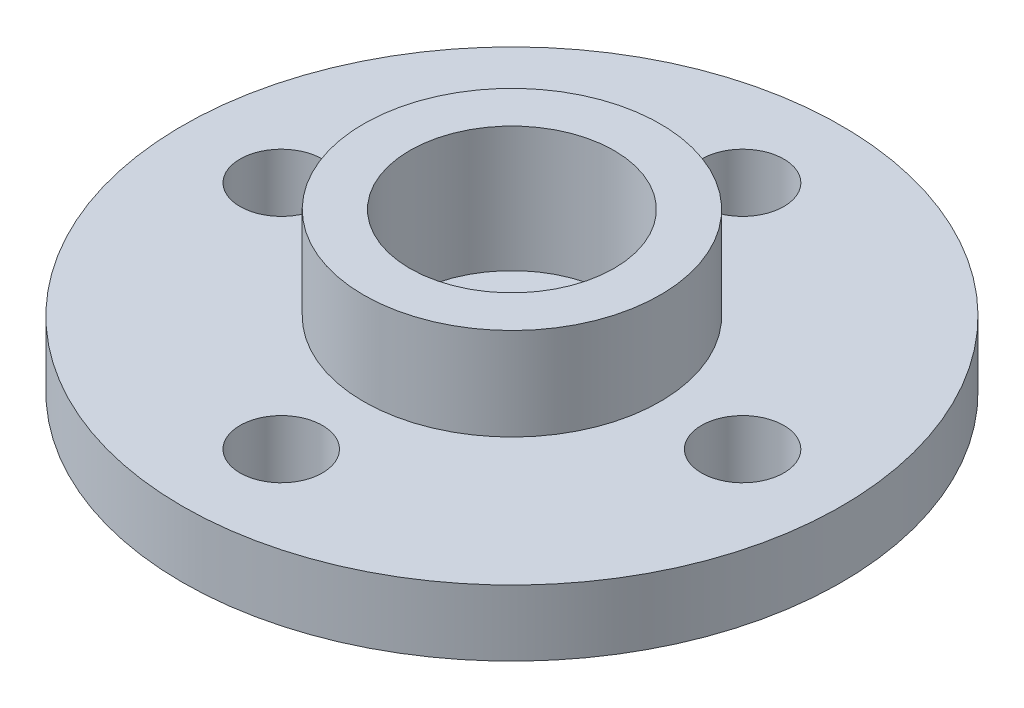
ISO-10303-21;
HEADER;
FILE_DESCRIPTION(('STEP AP214'),'2;1');
FILE_NAME('part.step','',(''),(''),'','','');
FILE_SCHEMA(('AUTOMOTIVE_DESIGN { 1 0 10303 214 1 1 1 1 }'));
ENDSEC;
DATA;
#1=APPLICATION_CONTEXT('core data for automotive mechanical design processes');
#2=APPLICATION_PROTOCOL_DEFINITION('international standard','automotive_design',2000,#1);
#3=PRODUCT_CONTEXT('',#1,'mechanical');
#4=PRODUCT('Part','Part','',(#3));
#5=PRODUCT_RELATED_PRODUCT_CATEGORY('part','',(#4));
#6=PRODUCT_DEFINITION_FORMATION('','',#4);
#7=PRODUCT_DEFINITION_CONTEXT('part definition',#1,'design');
#8=PRODUCT_DEFINITION('design','',#6,#7);
#9=PRODUCT_DEFINITION_SHAPE('','',#8);
#10=(LENGTH_UNIT() NAMED_UNIT(*) SI_UNIT(.MILLI.,.METRE.));
#11=(NAMED_UNIT(*) PLANE_ANGLE_UNIT() SI_UNIT($,.RADIAN.));
#12=(NAMED_UNIT(*) SI_UNIT($,.STERADIAN.) SOLID_ANGLE_UNIT());
#13=UNCERTAINTY_MEASURE_WITH_UNIT(LENGTH_MEASURE(1.E-05),#10,'distance_accuracy_value','');
#14=(GEOMETRIC_REPRESENTATION_CONTEXT(3) GLOBAL_UNCERTAINTY_ASSIGNED_CONTEXT((#13)) GLOBAL_UNIT_ASSIGNED_CONTEXT((#10,
#11,#12)) REPRESENTATION_CONTEXT('',''));
#15=CARTESIAN_POINT('',(0.,0.,0.));
#16=DIRECTION('',(0.,0.,1.));
#17=DIRECTION('',(1.,0.,0.));
#18=AXIS2_PLACEMENT_3D('',#15,#16,#17);
#19=CARTESIAN_POINT('',(0.,2.,0.));
#20=DIRECTION('',(0.,-1.,0.));
#21=DIRECTION('',(0.,0.,-1.));
#22=AXIS2_PLACEMENT_3D('',#19,#20,#21);
#23=CYLINDRICAL_SURFACE('',#22,10.);
#24=CARTESIAN_POINT('',(0.,2.,0.));
#25=DIRECTION('',(0.,1.,0.));
#26=DIRECTION('',(0.,0.,1.));
#27=AXIS2_PLACEMENT_3D('',#24,#25,#26);
#28=CIRCLE('',#27,10.);
#29=CARTESIAN_POINT('',(0.,2.,10.));
#30=VERTEX_POINT('',#29);
#31=EDGE_CURVE('E10',#30,#30,#28,.T.);
#32=ORIENTED_EDGE('',*,*,#31,.F.);
#33=EDGE_LOOP('',(#32));
#34=FACE_BOUND('',#33,.T.);
#35=CARTESIAN_POINT('',(0.,0.,0.));
#36=DIRECTION('',(0.,1.,0.));
#37=DIRECTION('',(0.,0.,1.));
#38=AXIS2_PLACEMENT_3D('',#35,#36,#37);
#39=CIRCLE('',#38,10.);
#40=CARTESIAN_POINT('',(0.,0.,10.));
#41=VERTEX_POINT('',#40);
#42=EDGE_CURVE('E40',#41,#41,#39,.T.);
#43=ORIENTED_EDGE('',*,*,#42,.T.);
#44=EDGE_LOOP('',(#43));
#45=FACE_BOUND('',#44,.T.);
#46=ADVANCED_FACE('F33',(#34,#45),#23,.T.);
#47=CARTESIAN_POINT('',(0.,2.,0.));
#48=DIRECTION('',(0.,1.,0.));
#49=DIRECTION('',(0.,0.,1.));
#50=AXIS2_PLACEMENT_3D('',#47,#48,#49);
#51=PLANE('',#50);
#52=CARTESIAN_POINT('',(0.,2.,-7.));
#53=DIRECTION('',(0.,1.,0.));
#54=DIRECTION('',(0.,0.,1.));
#55=AXIS2_PLACEMENT_3D('',#52,#53,#54);
#56=CIRCLE('',#55,1.25);
#57=CARTESIAN_POINT('',(0.,2.,-5.75));
#58=VERTEX_POINT('',#57);
#59=EDGE_CURVE('E78',#58,#58,#56,.T.);
#60=ORIENTED_EDGE('',*,*,#59,.F.);
#61=EDGE_LOOP('',(#60));
#62=FACE_BOUND('',#61,.T.);
#63=CARTESIAN_POINT('',(7.,2.,0.));
#64=DIRECTION('',(0.,1.,0.));
#65=DIRECTION('',(0.,0.,1.));
#66=AXIS2_PLACEMENT_3D('',#63,#64,#65);
#67=CIRCLE('',#66,1.25);
#68=CARTESIAN_POINT('',(7.,2.,1.25000000000005));
#69=VERTEX_POINT('',#68);
#70=EDGE_CURVE('E71',#69,#69,#67,.T.);
#71=ORIENTED_EDGE('',*,*,#70,.F.);
#72=EDGE_LOOP('',(#71));
#73=FACE_BOUND('',#72,.T.);
#74=CARTESIAN_POINT('',(0.,2.,7.));
#75=DIRECTION('',(0.,1.,0.));
#76=DIRECTION('',(0.,0.,1.));
#77=AXIS2_PLACEMENT_3D('',#74,#75,#76);
#78=CIRCLE('',#77,1.25);
#79=CARTESIAN_POINT('',(0.,2.,8.25));
#80=VERTEX_POINT('',#79);
#81=EDGE_CURVE('E72',#80,#80,#78,.T.);
#82=ORIENTED_EDGE('',*,*,#81,.F.);
#83=EDGE_LOOP('',(#82));
#84=FACE_BOUND('',#83,.T.);
#85=CARTESIAN_POINT('',(-7.,2.,0.));
#86=DIRECTION('',(0.,1.,0.));
#87=DIRECTION('',(0.,0.,1.));
#88=AXIS2_PLACEMENT_3D('',#85,#86,#87);
#89=CIRCLE('',#88,1.25);
#90=CARTESIAN_POINT('',(-7.,2.,1.25));
#91=VERTEX_POINT('',#90);
#92=EDGE_CURVE('E64',#91,#91,#89,.T.);
#93=ORIENTED_EDGE('',*,*,#92,.F.);
#94=EDGE_LOOP('',(#93));
#95=FACE_BOUND('',#94,.T.);
#96=CARTESIAN_POINT('',(0.,2.,0.));
#97=DIRECTION('',(0.,1.,0.));
#98=DIRECTION('',(0.,0.,1.));
#99=AXIS2_PLACEMENT_3D('',#96,#97,#98);
#100=CIRCLE('',#99,4.5);
#101=CARTESIAN_POINT('',(0.,2.,4.5));
#102=VERTEX_POINT('',#101);
#103=EDGE_CURVE('E47',#102,#102,#100,.T.);
#104=ORIENTED_EDGE('',*,*,#103,.F.);
#105=EDGE_LOOP('',(#104));
#106=FACE_BOUND('',#105,.T.);
#107=ORIENTED_EDGE('',*,*,#31,.T.);
#108=EDGE_LOOP('',(#107));
#109=FACE_BOUND('',#108,.T.);
#110=ADVANCED_FACE('F89',(#62,#73,#84,#95,#106,#109),#51,.T.);
#111=CARTESIAN_POINT('',(0.,0.,0.));
#112=DIRECTION('',(0.,1.,0.));
#113=DIRECTION('',(0.,0.,1.));
#114=AXIS2_PLACEMENT_3D('',#111,#112,#113);
#115=PLANE('',#114);
#116=CARTESIAN_POINT('',(0.,0.,-7.));
#117=DIRECTION('',(0.,1.,0.));
#118=DIRECTION('',(0.,0.,1.));
#119=AXIS2_PLACEMENT_3D('',#116,#117,#118);
#120=CIRCLE('',#119,1.25);
#121=CARTESIAN_POINT('',(0.,0.,-5.75));
#122=VERTEX_POINT('',#121);
#123=EDGE_CURVE('E67',#122,#122,#120,.F.);
#124=ORIENTED_EDGE('',*,*,#123,.F.);
#125=EDGE_LOOP('',(#124));
#126=FACE_BOUND('',#125,.T.);
#127=CARTESIAN_POINT('',(7.,0.,0.));
#128=DIRECTION('',(0.,1.,0.));
#129=DIRECTION('',(0.,0.,1.));
#130=AXIS2_PLACEMENT_3D('',#127,#128,#129);
#131=CIRCLE('',#130,1.25);
#132=CARTESIAN_POINT('',(7.,0.,1.25000000000005));
#133=VERTEX_POINT('',#132);
#134=EDGE_CURVE('E75',#133,#133,#131,.F.);
#135=ORIENTED_EDGE('',*,*,#134,.F.);
#136=EDGE_LOOP('',(#135));
#137=FACE_BOUND('',#136,.T.);
#138=CARTESIAN_POINT('',(0.,0.,7.));
#139=DIRECTION('',(0.,1.,0.));
#140=DIRECTION('',(0.,0.,1.));
#141=AXIS2_PLACEMENT_3D('',#138,#139,#140);
#142=CIRCLE('',#141,1.25);
#143=CARTESIAN_POINT('',(0.,0.,8.25));
#144=VERTEX_POINT('',#143);
#145=EDGE_CURVE('E68',#144,#144,#142,.F.);
#146=ORIENTED_EDGE('',*,*,#145,.F.);
#147=EDGE_LOOP('',(#146));
#148=FACE_BOUND('',#147,.T.);
#149=CARTESIAN_POINT('',(-7.,0.,0.));
#150=DIRECTION('',(0.,1.,0.));
#151=DIRECTION('',(0.,0.,1.));
#152=AXIS2_PLACEMENT_3D('',#149,#150,#151);
#153=CIRCLE('',#152,1.25);
#154=CARTESIAN_POINT('',(-7.,0.,1.25));
#155=VERTEX_POINT('',#154);
#156=EDGE_CURVE('E61',#155,#155,#153,.F.);
#157=ORIENTED_EDGE('',*,*,#156,.F.);
#158=EDGE_LOOP('',(#157));
#159=FACE_BOUND('',#158,.T.);
#160=CARTESIAN_POINT('',(0.,0.,0.));
#161=DIRECTION('',(0.,1.,0.));
#162=DIRECTION('',(0.,0.,1.));
#163=AXIS2_PLACEMENT_3D('',#160,#161,#162);
#164=CIRCLE('',#163,1.6);
#165=CARTESIAN_POINT('',(0.,0.,-1.6));
#166=VERTEX_POINT('',#165);
#167=EDGE_CURVE('E58',#166,#166,#164,.F.);
#168=ORIENTED_EDGE('',*,*,#167,.F.);
#169=EDGE_LOOP('',(#168));
#170=FACE_BOUND('',#169,.T.);
#171=ORIENTED_EDGE('',*,*,#42,.F.);
#172=EDGE_LOOP('',(#171));
#173=FACE_BOUND('',#172,.T.);
#174=ADVANCED_FACE('F92',(#126,#137,#148,#159,#170,#173),#115,.F.);
#175=CARTESIAN_POINT('',(0.,4.8,0.));
#176=DIRECTION('',(0.,-1.,0.));
#177=DIRECTION('',(0.,0.,-1.));
#178=AXIS2_PLACEMENT_3D('',#175,#176,#177);
#179=CYLINDRICAL_SURFACE('',#178,4.5);
#180=CARTESIAN_POINT('',(0.,4.8,0.));
#181=DIRECTION('',(0.,1.,0.));
#182=DIRECTION('',(0.,0.,1.));
#183=AXIS2_PLACEMENT_3D('',#180,#181,#182);
#184=CIRCLE('',#183,4.5);
#185=CARTESIAN_POINT('',(0.,4.8,4.5));
#186=VERTEX_POINT('',#185);
#187=EDGE_CURVE('E45',#186,#186,#184,.T.);
#188=ORIENTED_EDGE('',*,*,#187,.F.);
#189=EDGE_LOOP('',(#188));
#190=FACE_BOUND('',#189,.T.);
#191=ORIENTED_EDGE('',*,*,#103,.T.);
#192=EDGE_LOOP('',(#191));
#193=FACE_BOUND('',#192,.T.);
#194=ADVANCED_FACE('F102',(#190,#193),#179,.T.);
#195=CARTESIAN_POINT('',(0.,4.8,0.));
#196=DIRECTION('',(0.,1.,0.));
#197=DIRECTION('',(0.,0.,1.));
#198=AXIS2_PLACEMENT_3D('',#195,#196,#197);
#199=PLANE('',#198);
#200=CARTESIAN_POINT('',(0.,4.8,0.));
#201=DIRECTION('',(0.,1.,0.));
#202=DIRECTION('',(0.,0.,1.));
#203=AXIS2_PLACEMENT_3D('',#200,#201,#202);
#204=CIRCLE('',#203,3.1);
#205=CARTESIAN_POINT('',(0.,4.8,3.1));
#206=VERTEX_POINT('',#205);
#207=EDGE_CURVE('E53',#206,#206,#204,.T.);
#208=ORIENTED_EDGE('',*,*,#207,.F.);
#209=EDGE_LOOP('',(#208));
#210=FACE_BOUND('',#209,.T.);
#211=ORIENTED_EDGE('',*,*,#187,.T.);
#212=EDGE_LOOP('',(#211));
#213=FACE_BOUND('',#212,.T.);
#214=ADVANCED_FACE('F104',(#210,#213),#199,.T.);
#215=CARTESIAN_POINT('',(0.,1.,0.));
#216=DIRECTION('',(0.,1.,0.));
#217=DIRECTION('',(0.,0.,1.));
#218=AXIS2_PLACEMENT_3D('',#215,#216,#217);
#219=CYLINDRICAL_SURFACE('',#218,3.1);
#220=CARTESIAN_POINT('',(0.,1.,0.));
#221=DIRECTION('',(0.,1.,0.));
#222=DIRECTION('',(0.,0.,1.));
#223=AXIS2_PLACEMENT_3D('',#220,#221,#222);
#224=CIRCLE('',#223,3.1);
#225=CARTESIAN_POINT('',(0.,1.,3.1));
#226=VERTEX_POINT('',#225);
#227=EDGE_CURVE('E50',#226,#226,#224,.T.);
#228=CARTESIAN_POINT('',(0.,1.,3.1));
#229=CARTESIAN_POINT('',(0.,1.03958333333333,3.1));
#230=CARTESIAN_POINT('',(0.,1.07916666666667,3.1));
#231=CARTESIAN_POINT('',(0.,1.15833333333333,3.1));
#232=CARTESIAN_POINT('',(0.,1.19791666666667,3.1));
#233=CARTESIAN_POINT('',(0.,1.27708333333333,3.1));
#234=CARTESIAN_POINT('',(0.,1.31666666666667,3.1));
#235=CARTESIAN_POINT('',(0.,1.39583333333333,3.1));
#236=CARTESIAN_POINT('',(0.,1.43541666666667,3.1));
#237=CARTESIAN_POINT('',(0.,1.51458333333333,3.1));
#238=CARTESIAN_POINT('',(0.,1.55416666666667,3.1));
#239=CARTESIAN_POINT('',(0.,1.63333333333333,3.1));
#240=CARTESIAN_POINT('',(0.,1.67291666666667,3.1));
#241=CARTESIAN_POINT('',(0.,1.75208333333333,3.1));
#242=CARTESIAN_POINT('',(0.,1.79166666666667,3.1));
#243=CARTESIAN_POINT('',(0.,1.87083333333333,3.1));
#244=CARTESIAN_POINT('',(0.,1.91041666666667,3.1));
#245=CARTESIAN_POINT('',(0.,1.98958333333333,3.1));
#246=CARTESIAN_POINT('',(0.,2.02916666666667,3.1));
#247=CARTESIAN_POINT('',(0.,2.10833333333333,3.1));
#248=CARTESIAN_POINT('',(0.,2.14791666666667,3.1));
#249=CARTESIAN_POINT('',(0.,2.22708333333333,3.1));
#250=CARTESIAN_POINT('',(0.,2.26666666666667,3.1));
#251=CARTESIAN_POINT('',(0.,2.34583333333333,3.1));
#252=CARTESIAN_POINT('',(0.,2.38541666666667,3.1));
#253=CARTESIAN_POINT('',(0.,2.46458333333333,3.1));
#254=CARTESIAN_POINT('',(0.,2.50416666666667,3.1));
#255=CARTESIAN_POINT('',(0.,2.58333333333333,3.1));
#256=CARTESIAN_POINT('',(0.,2.62291666666667,3.1));
#257=CARTESIAN_POINT('',(0.,2.70208333333333,3.1));
#258=CARTESIAN_POINT('',(0.,2.74166666666667,3.1));
#259=CARTESIAN_POINT('',(0.,2.82083333333333,3.1));
#260=CARTESIAN_POINT('',(0.,2.86041666666667,3.1));
#261=CARTESIAN_POINT('',(0.,2.93958333333333,3.1));
#262=CARTESIAN_POINT('',(0.,2.97916666666667,3.1));
#263=CARTESIAN_POINT('',(0.,3.05833333333333,3.1));
#264=CARTESIAN_POINT('',(0.,3.09791666666667,3.1));
#265=CARTESIAN_POINT('',(0.,3.17708333333333,3.1));
#266=CARTESIAN_POINT('',(0.,3.21666666666667,3.1));
#267=CARTESIAN_POINT('',(0.,3.29583333333333,3.1));
#268=CARTESIAN_POINT('',(0.,3.33541666666667,3.1));
#269=CARTESIAN_POINT('',(0.,3.41458333333333,3.1));
#270=CARTESIAN_POINT('',(0.,3.45416666666667,3.1));
#271=CARTESIAN_POINT('',(0.,3.53333333333333,3.1));
#272=CARTESIAN_POINT('',(0.,3.57291666666667,3.1));
#273=CARTESIAN_POINT('',(0.,3.65208333333333,3.1));
#274=CARTESIAN_POINT('',(0.,3.69166666666667,3.1));
#275=CARTESIAN_POINT('',(0.,3.77083333333333,3.1));
#276=CARTESIAN_POINT('',(0.,3.81041666666667,3.1));
#277=CARTESIAN_POINT('',(0.,3.88958333333333,3.1));
#278=CARTESIAN_POINT('',(0.,3.92916666666667,3.1));
#279=CARTESIAN_POINT('',(0.,4.00833333333333,3.1));
#280=CARTESIAN_POINT('',(0.,4.04791666666667,3.1));
#281=CARTESIAN_POINT('',(0.,4.12708333333333,3.1));
#282=CARTESIAN_POINT('',(0.,4.16666666666667,3.1));
#283=CARTESIAN_POINT('',(0.,4.24583333333333,3.1));
#284=CARTESIAN_POINT('',(0.,4.28541666666667,3.1));
#285=CARTESIAN_POINT('',(0.,4.36458333333333,3.1));
#286=CARTESIAN_POINT('',(0.,4.40416666666667,3.1));
#287=CARTESIAN_POINT('',(0.,4.48333333333333,3.1));
#288=CARTESIAN_POINT('',(0.,4.52291666666667,3.1));
#289=CARTESIAN_POINT('',(0.,4.60208333333333,3.1));
#290=CARTESIAN_POINT('',(0.,4.64166666666667,3.1));
#291=CARTESIAN_POINT('',(0.,4.72083333333333,3.1));
#292=CARTESIAN_POINT('',(0.,4.76041666666667,3.1));
#293=CARTESIAN_POINT('',(0.,4.8,3.1));
#294=B_SPLINE_CURVE_WITH_KNOTS('',3,(#228,#229,#230,#231,#232,#233,#234,#235,#236,#237,#238,
#239,#240,#241,#242,#243,#244,#245,#246,#247,#248,#249,#250,#251,#252,#253,#254,#255,#256,#257,
#258,#259,#260,#261,#262,#263,#264,#265,#266,#267,#268,#269,#270,#271,#272,#273,#274,#275,#276,
#277,#278,#279,#280,#281,#282,#283,#284,#285,#286,#287,#288,#289,#290,#291,#292,#293),
.UNSPECIFIED.,.F.,.F.,(4,2,2,2,2,2,2,2,2,2,2,2,2,2,2,2,2,2,2,2,2,2,2,2,2,2,2,2,2,2,2,2,4),(0.,
0.11875,0.2375,0.35625,0.475,0.59375,0.7125,0.83125,0.95,1.06875,1.1875,1.30625,1.425,1.54375,
1.6625,1.78125,1.9,2.01875,2.1375,2.25625,2.375,2.49375,2.6125,2.73125,2.85,2.96875,3.0875,
3.20625,3.325,3.44375,3.5625,3.68125,3.8),.UNSPECIFIED.);
#295=EDGE_CURVE('BSEAM111',#226,#206,#294,.T.);
#296=ORIENTED_EDGE('',*,*,#227,.F.);
#297=ORIENTED_EDGE('',*,*,#207,.T.);
#298=ORIENTED_EDGE('',*,*,#295,.T.);
#299=ORIENTED_EDGE('',*,*,#295,.F.);
#300=EDGE_LOOP('',(#296,#298,#297,#299));
#301=FACE_BOUND('',#300,.T.);
#302=ADVANCED_FACE('F111',(#301),#219,.F.);
#303=CARTESIAN_POINT('',(0.,1.,0.));
#304=DIRECTION('',(0.,1.,0.));
#305=DIRECTION('',(0.,0.,1.));
#306=AXIS2_PLACEMENT_3D('',#303,#304,#305);
#307=PLANE('',#306);
#308=CARTESIAN_POINT('',(0.,1.,0.));
#309=DIRECTION('',(0.,1.,0.));
#310=DIRECTION('',(0.,0.,1.));
#311=AXIS2_PLACEMENT_3D('',#308,#309,#310);
#312=CIRCLE('',#311,1.6);
#313=CARTESIAN_POINT('',(0.,1.,-1.6));
#314=VERTEX_POINT('',#313);
#315=EDGE_CURVE('E36',#314,#314,#312,.F.);
#316=ORIENTED_EDGE('',*,*,#315,.T.);
#317=EDGE_LOOP('',(#316));
#318=FACE_BOUND('',#317,.T.);
#319=ORIENTED_EDGE('',*,*,#227,.T.);
#320=EDGE_LOOP('',(#319));
#321=FACE_BOUND('',#320,.T.);
#322=ADVANCED_FACE('F180',(#318,#321),#307,.T.);
#323=CARTESIAN_POINT('',(0.,4.8,0.));
#324=DIRECTION('',(0.,-1.,0.));
#325=DIRECTION('',(0.,0.,-1.));
#326=AXIS2_PLACEMENT_3D('',#323,#324,#325);
#327=CYLINDRICAL_SURFACE('',#326,1.6);
#328=CARTESIAN_POINT('',(0.,1.,-1.6));
#329=CARTESIAN_POINT('',(0.,0.989583333333334,-1.6));
#330=CARTESIAN_POINT('',(0.,0.979166666666667,-1.6));
#331=CARTESIAN_POINT('',(0.,0.958333333333334,-1.6));
#332=CARTESIAN_POINT('',(0.,0.947916666666667,-1.6));
#333=CARTESIAN_POINT('',(0.,0.927083333333334,-1.6));
#334=CARTESIAN_POINT('',(0.,0.916666666666667,-1.6));
#335=CARTESIAN_POINT('',(0.,0.895833333333334,-1.6));
#336=CARTESIAN_POINT('',(0.,0.885416666666667,-1.6));
#337=CARTESIAN_POINT('',(0.,0.864583333333334,-1.6));
#338=CARTESIAN_POINT('',(0.,0.854166666666667,-1.6));
#339=CARTESIAN_POINT('',(0.,0.833333333333334,-1.6));
#340=CARTESIAN_POINT('',(0.,0.822916666666667,-1.6));
#341=CARTESIAN_POINT('',(0.,0.802083333333334,-1.6));
#342=CARTESIAN_POINT('',(0.,0.791666666666667,-1.6));
#343=CARTESIAN_POINT('',(0.,0.770833333333334,-1.6));
#344=CARTESIAN_POINT('',(0.,0.760416666666667,-1.6));
#345=CARTESIAN_POINT('',(0.,0.739583333333334,-1.6));
#346=CARTESIAN_POINT('',(0.,0.729166666666667,-1.6));
#347=CARTESIAN_POINT('',(0.,0.708333333333334,-1.6));
#348=CARTESIAN_POINT('',(0.,0.697916666666667,-1.6));
#349=CARTESIAN_POINT('',(0.,0.677083333333334,-1.6));
#350=CARTESIAN_POINT('',(0.,0.666666666666667,-1.6));
#351=CARTESIAN_POINT('',(0.,0.645833333333334,-1.6));
#352=CARTESIAN_POINT('',(0.,0.635416666666667,-1.6));
#353=CARTESIAN_POINT('',(0.,0.614583333333334,-1.6));
#354=CARTESIAN_POINT('',(0.,0.604166666666667,-1.6));
#355=CARTESIAN_POINT('',(0.,0.583333333333334,-1.6));
#356=CARTESIAN_POINT('',(0.,0.572916666666667,-1.6));
#357=CARTESIAN_POINT('',(0.,0.552083333333334,-1.6));
#358=CARTESIAN_POINT('',(0.,0.541666666666667,-1.6));
#359=CARTESIAN_POINT('',(0.,0.520833333333333,-1.6));
#360=CARTESIAN_POINT('',(0.,0.510416666666666,-1.6));
#361=CARTESIAN_POINT('',(0.,0.489583333333333,-1.6));
#362=CARTESIAN_POINT('',(0.,0.479166666666666,-1.6));
#363=CARTESIAN_POINT('',(0.,0.458333333333333,-1.6));
#364=CARTESIAN_POINT('',(0.,0.447916666666666,-1.6));
#365=CARTESIAN_POINT('',(0.,0.427083333333333,-1.6));
#366=CARTESIAN_POINT('',(0.,0.416666666666666,-1.6));
#367=CARTESIAN_POINT('',(0.,0.395833333333333,-1.6));
#368=CARTESIAN_POINT('',(0.,0.385416666666666,-1.6));
#369=CARTESIAN_POINT('',(0.,0.364583333333333,-1.6));
#370=CARTESIAN_POINT('',(0.,0.354166666666666,-1.6));
#371=CARTESIAN_POINT('',(0.,0.333333333333333,-1.6));
#372=CARTESIAN_POINT('',(0.,0.322916666666666,-1.6));
#373=CARTESIAN_POINT('',(0.,0.302083333333333,-1.6));
#374=CARTESIAN_POINT('',(0.,0.291666666666666,-1.6));
#375=CARTESIAN_POINT('',(0.,0.270833333333333,-1.6));
#376=CARTESIAN_POINT('',(0.,0.260416666666666,-1.6));
#377=CARTESIAN_POINT('',(0.,0.239583333333333,-1.6));
#378=CARTESIAN_POINT('',(0.,0.229166666666666,-1.6));
#379=CARTESIAN_POINT('',(0.,0.208333333333333,-1.6));
#380=CARTESIAN_POINT('',(0.,0.197916666666666,-1.6));
#381=CARTESIAN_POINT('',(0.,0.177083333333333,-1.6));
#382=CARTESIAN_POINT('',(0.,0.166666666666666,-1.6));
#383=CARTESIAN_POINT('',(0.,0.145833333333333,-1.6));
#384=CARTESIAN_POINT('',(0.,0.135416666666666,-1.6));
#385=CARTESIAN_POINT('',(0.,0.114583333333333,-1.6));
#386=CARTESIAN_POINT('',(0.,0.104166666666666,-1.6));
#387=CARTESIAN_POINT('',(0.,0.0833333333333325,-1.6));
#388=CARTESIAN_POINT('',(0.,0.0729166666666659,-1.6));
#389=CARTESIAN_POINT('',(0.,0.0520833333333325,-1.6));
#390=CARTESIAN_POINT('',(0.,0.0416666666666658,-1.6));
#391=CARTESIAN_POINT('',(0.,0.0208333333333325,-1.6));
#392=CARTESIAN_POINT('',(0.,0.0104166666666658,-1.6));
#393=CARTESIAN_POINT('',(0.,0.,-1.6));
#394=B_SPLINE_CURVE_WITH_KNOTS('',3,(#328,#329,#330,#331,#332,#333,#334,#335,#336,#337,#338,
#339,#340,#341,#342,#343,#344,#345,#346,#347,#348,#349,#350,#351,#352,#353,#354,#355,#356,#357,
#358,#359,#360,#361,#362,#363,#364,#365,#366,#367,#368,#369,#370,#371,#372,#373,#374,#375,#376,
#377,#378,#379,#380,#381,#382,#383,#384,#385,#386,#387,#388,#389,#390,#391,#392,#393),
.UNSPECIFIED.,.F.,.F.,(4,2,2,2,2,2,2,2,2,2,2,2,2,2,2,2,2,2,2,2,2,2,2,2,2,2,2,2,2,2,2,2,4),(0.,
0.03125,0.0625000000000001,0.0937500000000001,0.125,0.15625,0.1875,0.21875,0.25,0.28125,0.3125,
0.34375,0.375,0.40625,0.4375,0.468750000000001,0.500000000000001,0.531250000000001,
0.562500000000001,0.593750000000001,0.625000000000001,0.656250000000001,0.687500000000001,
0.718750000000001,0.750000000000001,0.781250000000001,0.812500000000001,0.843750000000001,
0.875000000000001,0.906250000000001,0.937500000000001,0.968750000000001,1.),.UNSPECIFIED.);
#395=EDGE_CURVE('BSEAM144',#314,#166,#394,.T.);
#396=ORIENTED_EDGE('',*,*,#315,.F.);
#397=ORIENTED_EDGE('',*,*,#167,.T.);
#398=ORIENTED_EDGE('',*,*,#395,.T.);
#399=ORIENTED_EDGE('',*,*,#395,.F.);
#400=EDGE_LOOP('',(#396,#398,#397,#399));
#401=FACE_BOUND('',#400,.T.);
#402=ADVANCED_FACE('F144',(#401),#327,.F.);
#403=CARTESIAN_POINT('',(-7.,-0.00100000000000013,0.));
#404=DIRECTION('',(0.,1.,0.));
#405=DIRECTION('',(0.,0.,1.));
#406=AXIS2_PLACEMENT_3D('',#403,#404,#405);
#407=CYLINDRICAL_SURFACE('',#406,1.25);
#408=ORIENTED_EDGE('',*,*,#92,.T.);
#409=EDGE_LOOP('',(#408));
#410=FACE_BOUND('',#409,.T.);
#411=ORIENTED_EDGE('',*,*,#156,.T.);
#412=EDGE_LOOP('',(#411));
#413=FACE_BOUND('',#412,.T.);
#414=ADVANCED_FACE('F138',(#410,#413),#407,.F.);
#415=CARTESIAN_POINT('',(0.,-0.00100000000000013,7.));
#416=DIRECTION('',(0.,1.,0.));
#417=DIRECTION('',(0.,0.,1.));
#418=AXIS2_PLACEMENT_3D('',#415,#416,#417);
#419=CYLINDRICAL_SURFACE('',#418,1.25);
#420=ORIENTED_EDGE('',*,*,#81,.T.);
#421=EDGE_LOOP('',(#420));
#422=FACE_BOUND('',#421,.T.);
#423=ORIENTED_EDGE('',*,*,#145,.T.);
#424=EDGE_LOOP('',(#423));
#425=FACE_BOUND('',#424,.T.);
#426=ADVANCED_FACE('F143',(#422,#425),#419,.F.);
#427=CARTESIAN_POINT('',(7.,-0.00100000000000013,0.));
#428=DIRECTION('',(0.,1.,0.));
#429=DIRECTION('',(0.,0.,1.));
#430=AXIS2_PLACEMENT_3D('',#427,#428,#429);
#431=CYLINDRICAL_SURFACE('',#430,1.25);
#432=ORIENTED_EDGE('',*,*,#70,.T.);
#433=EDGE_LOOP('',(#432));
#434=FACE_BOUND('',#433,.T.);
#435=ORIENTED_EDGE('',*,*,#134,.T.);
#436=EDGE_LOOP('',(#435));
#437=FACE_BOUND('',#436,.T.);
#438=ADVANCED_FACE('F156',(#434,#437),#431,.F.);
#439=CARTESIAN_POINT('',(0.,-0.00100000000000013,-7.));
#440=DIRECTION('',(0.,1.,0.));
#441=DIRECTION('',(0.,0.,1.));
#442=AXIS2_PLACEMENT_3D('',#439,#440,#441);
#443=CYLINDRICAL_SURFACE('',#442,1.25);
#444=ORIENTED_EDGE('',*,*,#59,.T.);
#445=EDGE_LOOP('',(#444));
#446=FACE_BOUND('',#445,.T.);
#447=ORIENTED_EDGE('',*,*,#123,.T.);
#448=EDGE_LOOP('',(#447));
#449=FACE_BOUND('',#448,.T.);
#450=ADVANCED_FACE('F86',(#446,#449),#443,.F.);
#451=CLOSED_SHELL('',(#46,#110,#174,#194,#214,#302,#322,#402,#414,#426,#438,#450));
#452=MANIFOLD_SOLID_BREP('B2',#451);
#453=ADVANCED_BREP_SHAPE_REPRESENTATION('',(#18,#452),#14);
#454=SHAPE_DEFINITION_REPRESENTATION(#9,#453);
ENDSEC;
END-ISO-10303-21;
